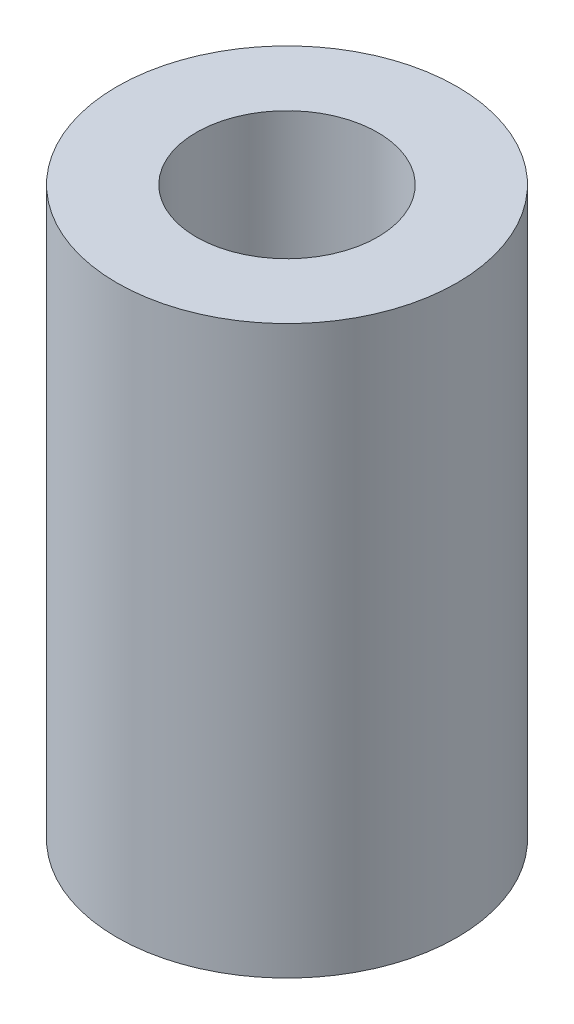
ISO-10303-21;
HEADER;
FILE_DESCRIPTION(('STEP AP214'),'2;1');
FILE_NAME('part.step','',(''),(''),'','','');
FILE_SCHEMA(('AUTOMOTIVE_DESIGN { 1 0 10303 214 1 1 1 1 }'));
ENDSEC;
DATA;
#1=APPLICATION_CONTEXT('core data for automotive mechanical design processes');
#2=APPLICATION_PROTOCOL_DEFINITION('international standard','automotive_design',2000,#1);
#3=PRODUCT_CONTEXT('',#1,'mechanical');
#4=PRODUCT('Part','Part','',(#3));
#5=PRODUCT_RELATED_PRODUCT_CATEGORY('part','',(#4));
#6=PRODUCT_DEFINITION_FORMATION('','',#4);
#7=PRODUCT_DEFINITION_CONTEXT('part definition',#1,'design');
#8=PRODUCT_DEFINITION('design','',#6,#7);
#9=PRODUCT_DEFINITION_SHAPE('','',#8);
#10=(LENGTH_UNIT() NAMED_UNIT(*) SI_UNIT(.MILLI.,.METRE.));
#11=(NAMED_UNIT(*) PLANE_ANGLE_UNIT() SI_UNIT($,.RADIAN.));
#12=(NAMED_UNIT(*) SI_UNIT($,.STERADIAN.) SOLID_ANGLE_UNIT());
#13=UNCERTAINTY_MEASURE_WITH_UNIT(LENGTH_MEASURE(1.E-05),#10,'distance_accuracy_value','');
#14=(GEOMETRIC_REPRESENTATION_CONTEXT(3) GLOBAL_UNCERTAINTY_ASSIGNED_CONTEXT((#13)) GLOBAL_UNIT_ASSIGNED_CONTEXT((#10,
#11,#12)) REPRESENTATION_CONTEXT('',''));
#15=CARTESIAN_POINT('',(0.,0.,0.));
#16=DIRECTION('',(0.,0.,1.));
#17=DIRECTION('',(1.,0.,0.));
#18=AXIS2_PLACEMENT_3D('',#15,#16,#17);
#19=CARTESIAN_POINT('',(0.,10.,0.));
#20=DIRECTION('',(0.,1.,0.));
#21=DIRECTION('',(0.,0.,1.));
#22=AXIS2_PLACEMENT_3D('',#19,#20,#21);
#23=PLANE('',#22);
#24=CARTESIAN_POINT('',(0.,10.,0.));
#25=DIRECTION('',(0.,1.,0.));
#26=DIRECTION('',(0.,0.,1.));
#27=AXIS2_PLACEMENT_3D('',#24,#25,#26);
#28=CIRCLE('',#27,3.);
#29=CARTESIAN_POINT('',(0.,10.,3.));
#30=VERTEX_POINT('',#29);
#31=EDGE_CURVE('E10',#30,#30,#28,.T.);
#32=ORIENTED_EDGE('',*,*,#31,.T.);
#33=EDGE_LOOP('',(#32));
#34=FACE_BOUND('',#33,.T.);
#35=CARTESIAN_POINT('',(0.,10.,0.));
#36=DIRECTION('',(0.,1.,0.));
#37=DIRECTION('',(0.,0.,1.));
#38=AXIS2_PLACEMENT_3D('',#35,#36,#37);
#39=CIRCLE('',#38,1.6);
#40=CARTESIAN_POINT('',(0.,10.,1.6));
#41=VERTEX_POINT('',#40);
#42=EDGE_CURVE('E50',#41,#41,#39,.T.);
#43=ORIENTED_EDGE('',*,*,#42,.F.);
#44=EDGE_LOOP('',(#43));
#45=FACE_BOUND('',#44,.T.);
#46=ADVANCED_FACE('F37',(#34,#45),#23,.T.);
#47=CARTESIAN_POINT('',(0.,0.,0.));
#48=DIRECTION('',(0.,1.,0.));
#49=DIRECTION('',(0.,0.,1.));
#50=AXIS2_PLACEMENT_3D('',#47,#48,#49);
#51=PLANE('',#50);
#52=CARTESIAN_POINT('',(0.,0.,0.));
#53=DIRECTION('',(0.,1.,0.));
#54=DIRECTION('',(0.,0.,1.));
#55=AXIS2_PLACEMENT_3D('',#52,#53,#54);
#56=CIRCLE('',#55,3.);
#57=CARTESIAN_POINT('',(0.,0.,3.));
#58=VERTEX_POINT('',#57);
#59=EDGE_CURVE('E41',#58,#58,#56,.T.);
#60=ORIENTED_EDGE('',*,*,#59,.F.);
#61=EDGE_LOOP('',(#60));
#62=FACE_BOUND('',#61,.T.);
#63=CARTESIAN_POINT('',(0.,0.,0.));
#64=DIRECTION('',(0.,1.,0.));
#65=DIRECTION('',(0.,0.,1.));
#66=AXIS2_PLACEMENT_3D('',#63,#64,#65);
#67=CIRCLE('',#66,1.6);
#68=CARTESIAN_POINT('',(0.,0.,1.6));
#69=VERTEX_POINT('',#68);
#70=EDGE_CURVE('E52',#69,#69,#67,.T.);
#71=ORIENTED_EDGE('',*,*,#70,.T.);
#72=EDGE_LOOP('',(#71));
#73=FACE_BOUND('',#72,.T.);
#74=ADVANCED_FACE('F64',(#62,#73),#51,.F.);
#75=CARTESIAN_POINT('',(0.,10.,0.));
#76=DIRECTION('',(0.,-1.,0.));
#77=DIRECTION('',(0.,0.,-1.));
#78=AXIS2_PLACEMENT_3D('',#75,#76,#77);
#79=CYLINDRICAL_SURFACE('',#78,3.);
#80=ORIENTED_EDGE('',*,*,#31,.F.);
#81=EDGE_LOOP('',(#80));
#82=FACE_BOUND('',#81,.T.);
#83=ORIENTED_EDGE('',*,*,#59,.T.);
#84=EDGE_LOOP('',(#83));
#85=FACE_BOUND('',#84,.T.);
#86=ADVANCED_FACE('F39',(#82,#85),#79,.T.);
#87=CARTESIAN_POINT('',(0.,10.,0.));
#88=DIRECTION('',(0.,-1.,0.));
#89=DIRECTION('',(0.,0.,-1.));
#90=AXIS2_PLACEMENT_3D('',#87,#88,#89);
#91=CYLINDRICAL_SURFACE('',#90,1.6);
#92=ORIENTED_EDGE('',*,*,#42,.T.);
#93=EDGE_LOOP('',(#92));
#94=FACE_BOUND('',#93,.T.);
#95=ORIENTED_EDGE('',*,*,#70,.F.);
#96=EDGE_LOOP('',(#95));
#97=FACE_BOUND('',#96,.T.);
#98=ADVANCED_FACE('F60',(#94,#97),#91,.F.);
#99=CLOSED_SHELL('',(#46,#74,#86,#98));
#100=MANIFOLD_SOLID_BREP('B2',#99);
#101=ADVANCED_BREP_SHAPE_REPRESENTATION('',(#18,#100),#14);
#102=SHAPE_DEFINITION_REPRESENTATION(#9,#101);
ENDSEC;
END-ISO-10303-21;
